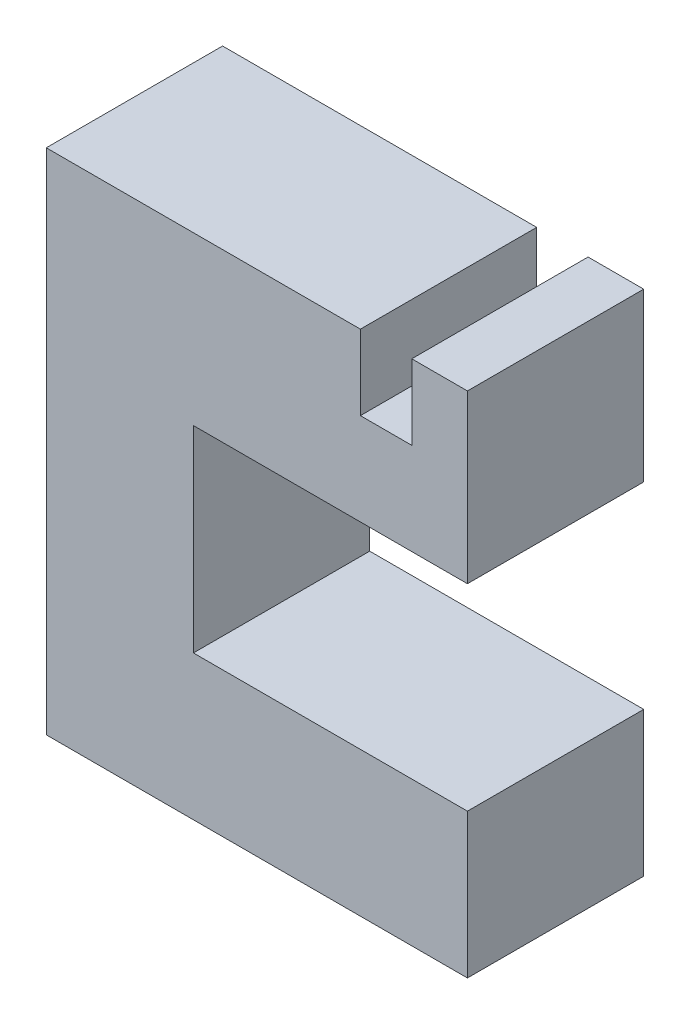
ISO-10303-21;
HEADER;
FILE_DESCRIPTION(('STEP AP214'),'2;1');
FILE_NAME('part.step','',(''),(''),'','','');
FILE_SCHEMA(('AUTOMOTIVE_DESIGN { 1 0 10303 214 1 1 1 1 }'));
ENDSEC;
DATA;
#1=APPLICATION_CONTEXT('core data for automotive mechanical design processes');
#2=APPLICATION_PROTOCOL_DEFINITION('international standard','automotive_design',2000,#1);
#3=PRODUCT_CONTEXT('',#1,'mechanical');
#4=PRODUCT('Part','Part','',(#3));
#5=PRODUCT_RELATED_PRODUCT_CATEGORY('part','',(#4));
#6=PRODUCT_DEFINITION_FORMATION('','',#4);
#7=PRODUCT_DEFINITION_CONTEXT('part definition',#1,'design');
#8=PRODUCT_DEFINITION('design','',#6,#7);
#9=PRODUCT_DEFINITION_SHAPE('','',#8);
#10=(LENGTH_UNIT() NAMED_UNIT(*) SI_UNIT(.MILLI.,.METRE.));
#11=(NAMED_UNIT(*) PLANE_ANGLE_UNIT() SI_UNIT($,.RADIAN.));
#12=(NAMED_UNIT(*) SI_UNIT($,.STERADIAN.) SOLID_ANGLE_UNIT());
#13=UNCERTAINTY_MEASURE_WITH_UNIT(LENGTH_MEASURE(1.E-05),#10,'distance_accuracy_value','');
#14=(GEOMETRIC_REPRESENTATION_CONTEXT(3) GLOBAL_UNCERTAINTY_ASSIGNED_CONTEXT((#13)) GLOBAL_UNIT_ASSIGNED_CONTEXT((#10,
#11,#12)) REPRESENTATION_CONTEXT('',''));
#15=CARTESIAN_POINT('',(0.,0.,0.));
#16=DIRECTION('',(0.,0.,1.));
#17=DIRECTION('',(1.,0.,0.));
#18=AXIS2_PLACEMENT_3D('',#15,#16,#17);
#19=CARTESIAN_POINT('',(0.,0.,20.));
#20=DIRECTION('',(1.,0.,0.));
#21=DIRECTION('',(0.,0.,-1.));
#22=AXIS2_PLACEMENT_3D('',#19,#20,#21);
#23=PLANE('',#22);
#24=DIRECTION('',(0.,-1.,0.));
#25=VECTOR('',#24,1.);
#26=CARTESIAN_POINT('',(0.,0.,0.));
#27=LINE('',#26,#25);
#28=CARTESIAN_POINT('',(0.,57.6785714285714,0.));
#29=VERTEX_POINT('',#28);
#30=CARTESIAN_POINT('',(0.,0.,0.));
#31=VERTEX_POINT('',#30);
#32=EDGE_CURVE('E153',#29,#31,#27,.T.);
#33=ORIENTED_EDGE('',*,*,#32,.T.);
#34=DIRECTION('',(0.,0.,-1.));
#35=VECTOR('',#34,1.);
#36=CARTESIAN_POINT('',(0.,0.,20.));
#37=LINE('',#36,#35);
#38=CARTESIAN_POINT('',(0.,0.,20.));
#39=VERTEX_POINT('',#38);
#40=EDGE_CURVE('E11',#39,#31,#37,.T.);
#41=ORIENTED_EDGE('',*,*,#40,.F.);
#42=DIRECTION('',(0.,-1.,0.));
#43=VECTOR('',#42,1.);
#44=CARTESIAN_POINT('',(0.,0.,20.));
#45=LINE('',#44,#43);
#46=CARTESIAN_POINT('',(0.,57.6785714285714,20.));
#47=VERTEX_POINT('',#46);
#48=EDGE_CURVE('E175',#47,#39,#45,.T.);
#49=ORIENTED_EDGE('',*,*,#48,.F.);
#50=DIRECTION('',(0.,0.,-1.));
#51=VECTOR('',#50,1.);
#52=CARTESIAN_POINT('',(0.,57.6785714285714,20.));
#53=LINE('',#52,#51);
#54=EDGE_CURVE('E149',#47,#29,#53,.T.);
#55=ORIENTED_EDGE('',*,*,#54,.T.);
#56=EDGE_LOOP('',(#33,#41,#49,#55));
#57=FACE_BOUND('',#56,.T.);
#58=ADVANCED_FACE('F33',(#57),#23,.F.);
#59=CARTESIAN_POINT('',(0.,0.,20.));
#60=DIRECTION('',(0.,1.,0.));
#61=DIRECTION('',(0.,0.,1.));
#62=AXIS2_PLACEMENT_3D('',#59,#60,#61);
#63=PLANE('',#62);
#64=DIRECTION('',(1.,0.,0.));
#65=VECTOR('',#64,1.);
#66=CARTESIAN_POINT('',(0.,0.,0.));
#67=LINE('',#66,#65);
#68=CARTESIAN_POINT('',(47.777011133762,0.,0.));
#69=VERTEX_POINT('',#68);
#70=EDGE_CURVE('E156',#31,#69,#67,.T.);
#71=ORIENTED_EDGE('',*,*,#70,.T.);
#72=DIRECTION('',(0.,0.,-1.));
#73=VECTOR('',#72,1.);
#74=CARTESIAN_POINT('',(47.777011133762,0.,20.));
#75=LINE('',#74,#73);
#76=CARTESIAN_POINT('',(47.777011133762,0.,20.));
#77=VERTEX_POINT('',#76);
#78=EDGE_CURVE('E41',#77,#69,#75,.T.);
#79=ORIENTED_EDGE('',*,*,#78,.F.);
#80=DIRECTION('',(1.,0.,0.));
#81=VECTOR('',#80,1.);
#82=CARTESIAN_POINT('',(0.,0.,20.));
#83=LINE('',#82,#81);
#84=EDGE_CURVE('E104',#39,#77,#83,.T.);
#85=ORIENTED_EDGE('',*,*,#84,.F.);
#86=ORIENTED_EDGE('',*,*,#40,.T.);
#87=EDGE_LOOP('',(#71,#79,#85,#86));
#88=FACE_BOUND('',#87,.T.);
#89=ADVANCED_FACE('F253',(#88),#63,.F.);
#90=CARTESIAN_POINT('',(47.777011133762,16.3928571428572,20.));
#91=DIRECTION('',(-1.,0.,0.));
#92=DIRECTION('',(0.,0.,1.));
#93=AXIS2_PLACEMENT_3D('',#90,#91,#92);
#94=PLANE('',#93);
#95=DIRECTION('',(0.,1.,0.));
#96=VECTOR('',#95,1.);
#97=CARTESIAN_POINT('',(47.777011133762,16.3928571428572,0.));
#98=LINE('',#97,#96);
#99=CARTESIAN_POINT('',(47.777011133762,16.3928571428572,0.));
#100=VERTEX_POINT('',#99);
#101=EDGE_CURVE('E158',#69,#100,#98,.T.);
#102=ORIENTED_EDGE('',*,*,#101,.T.);
#103=DIRECTION('',(0.,0.,-1.));
#104=VECTOR('',#103,1.);
#105=CARTESIAN_POINT('',(47.777011133762,16.3928571428572,20.));
#106=LINE('',#105,#104);
#107=CARTESIAN_POINT('',(47.777011133762,16.3928571428572,20.));
#108=VERTEX_POINT('',#107);
#109=EDGE_CURVE('E194',#108,#100,#106,.T.);
#110=ORIENTED_EDGE('',*,*,#109,.F.);
#111=DIRECTION('',(0.,1.,0.));
#112=VECTOR('',#111,1.);
#113=CARTESIAN_POINT('',(47.777011133762,16.3928571428572,20.));
#114=LINE('',#113,#112);
#115=EDGE_CURVE('E202',#77,#108,#114,.T.);
#116=ORIENTED_EDGE('',*,*,#115,.F.);
#117=ORIENTED_EDGE('',*,*,#78,.T.);
#118=EDGE_LOOP('',(#102,#110,#116,#117));
#119=FACE_BOUND('',#118,.T.);
#120=ADVANCED_FACE('F200',(#119),#94,.F.);
#121=CARTESIAN_POINT('',(16.6912968480477,16.3928571428572,20.));
#122=DIRECTION('',(0.,-1.,0.));
#123=DIRECTION('',(0.,0.,-1.));
#124=AXIS2_PLACEMENT_3D('',#121,#122,#123);
#125=PLANE('',#124);
#126=DIRECTION('',(-1.,0.,0.));
#127=VECTOR('',#126,1.);
#128=CARTESIAN_POINT('',(16.6912968480477,16.3928571428572,0.));
#129=LINE('',#128,#127);
#130=CARTESIAN_POINT('',(16.6912968480477,16.3928571428572,0.));
#131=VERTEX_POINT('',#130);
#132=EDGE_CURVE('E160',#100,#131,#129,.T.);
#133=ORIENTED_EDGE('',*,*,#132,.T.);
#134=DIRECTION('',(0.,0.,-1.));
#135=VECTOR('',#134,1.);
#136=CARTESIAN_POINT('',(16.6912968480477,16.3928571428572,20.));
#137=LINE('',#136,#135);
#138=CARTESIAN_POINT('',(16.6912968480477,16.3928571428572,20.));
#139=VERTEX_POINT('',#138);
#140=EDGE_CURVE('E191',#139,#131,#137,.T.);
#141=ORIENTED_EDGE('',*,*,#140,.F.);
#142=DIRECTION('',(-1.,0.,0.));
#143=VECTOR('',#142,1.);
#144=CARTESIAN_POINT('',(16.6912968480477,16.3928571428572,20.));
#145=LINE('',#144,#143);
#146=EDGE_CURVE('E220',#108,#139,#145,.T.);
#147=ORIENTED_EDGE('',*,*,#146,.F.);
#148=ORIENTED_EDGE('',*,*,#109,.T.);
#149=EDGE_LOOP('',(#133,#141,#147,#148));
#150=FACE_BOUND('',#149,.T.);
#151=ADVANCED_FACE('F211',(#150),#125,.F.);
#152=CARTESIAN_POINT('',(16.6912968480477,38.7357142857143,20.));
#153=DIRECTION('',(-1.,0.,0.));
#154=DIRECTION('',(0.,0.,1.));
#155=AXIS2_PLACEMENT_3D('',#152,#153,#154);
#156=PLANE('',#155);
#157=DIRECTION('',(0.,1.,0.));
#158=VECTOR('',#157,1.);
#159=CARTESIAN_POINT('',(16.6912968480477,38.7357142857143,0.));
#160=LINE('',#159,#158);
#161=CARTESIAN_POINT('',(16.6912968480477,38.7357142857143,0.));
#162=VERTEX_POINT('',#161);
#163=EDGE_CURVE('E162',#131,#162,#160,.T.);
#164=ORIENTED_EDGE('',*,*,#163,.T.);
#165=DIRECTION('',(0.,0.,-1.));
#166=VECTOR('',#165,1.);
#167=CARTESIAN_POINT('',(16.6912968480477,38.7357142857143,20.));
#168=LINE('',#167,#166);
#169=CARTESIAN_POINT('',(16.6912968480477,38.7357142857143,20.));
#170=VERTEX_POINT('',#169);
#171=EDGE_CURVE('E188',#170,#162,#168,.T.);
#172=ORIENTED_EDGE('',*,*,#171,.F.);
#173=DIRECTION('',(0.,1.,0.));
#174=VECTOR('',#173,1.);
#175=CARTESIAN_POINT('',(16.6912968480477,38.7357142857143,20.));
#176=LINE('',#175,#174);
#177=EDGE_CURVE('E217',#139,#170,#176,.T.);
#178=ORIENTED_EDGE('',*,*,#177,.F.);
#179=ORIENTED_EDGE('',*,*,#140,.T.);
#180=EDGE_LOOP('',(#164,#172,#178,#179));
#181=FACE_BOUND('',#180,.T.);
#182=ADVANCED_FACE('F215',(#181),#156,.F.);
#183=CARTESIAN_POINT('',(47.777011133762,38.7357142857143,20.));
#184=DIRECTION('',(0.,1.,0.));
#185=DIRECTION('',(0.,0.,1.));
#186=AXIS2_PLACEMENT_3D('',#183,#184,#185);
#187=PLANE('',#186);
#188=DIRECTION('',(1.,0.,0.));
#189=VECTOR('',#188,1.);
#190=CARTESIAN_POINT('',(47.777011133762,38.7357142857143,0.));
#191=LINE('',#190,#189);
#192=CARTESIAN_POINT('',(47.777011133762,38.7357142857143,0.));
#193=VERTEX_POINT('',#192);
#194=EDGE_CURVE('E164',#162,#193,#191,.T.);
#195=ORIENTED_EDGE('',*,*,#194,.T.);
#196=DIRECTION('',(0.,0.,-1.));
#197=VECTOR('',#196,1.);
#198=CARTESIAN_POINT('',(47.777011133762,38.7357142857143,20.));
#199=LINE('',#198,#197);
#200=CARTESIAN_POINT('',(47.777011133762,38.7357142857143,20.));
#201=VERTEX_POINT('',#200);
#202=EDGE_CURVE('E185',#201,#193,#199,.T.);
#203=ORIENTED_EDGE('',*,*,#202,.F.);
#204=DIRECTION('',(1.,0.,0.));
#205=VECTOR('',#204,1.);
#206=CARTESIAN_POINT('',(47.777011133762,38.7357142857143,20.));
#207=LINE('',#206,#205);
#208=EDGE_CURVE('E219',#170,#201,#207,.T.);
#209=ORIENTED_EDGE('',*,*,#208,.F.);
#210=ORIENTED_EDGE('',*,*,#171,.T.);
#211=EDGE_LOOP('',(#195,#203,#209,#210));
#212=FACE_BOUND('',#211,.T.);
#213=ADVANCED_FACE('F266',(#212),#187,.F.);
#214=CARTESIAN_POINT('',(47.777011133762,57.6785714285714,20.));
#215=DIRECTION('',(-1.,0.,0.));
#216=DIRECTION('',(0.,0.,1.));
#217=AXIS2_PLACEMENT_3D('',#214,#215,#216);
#218=PLANE('',#217);
#219=DIRECTION('',(0.,1.,0.));
#220=VECTOR('',#219,1.);
#221=CARTESIAN_POINT('',(47.777011133762,57.6785714285714,0.));
#222=LINE('',#221,#220);
#223=CARTESIAN_POINT('',(47.777011133762,57.6785714285714,0.));
#224=VERTEX_POINT('',#223);
#225=EDGE_CURVE('E166',#193,#224,#222,.T.);
#226=ORIENTED_EDGE('',*,*,#225,.T.);
#227=DIRECTION('',(0.,0.,-1.));
#228=VECTOR('',#227,1.);
#229=CARTESIAN_POINT('',(47.777011133762,57.6785714285714,20.));
#230=LINE('',#229,#228);
#231=CARTESIAN_POINT('',(47.777011133762,57.6785714285714,20.));
#232=VERTEX_POINT('',#231);
#233=EDGE_CURVE('E182',#232,#224,#230,.T.);
#234=ORIENTED_EDGE('',*,*,#233,.F.);
#235=DIRECTION('',(0.,1.,0.));
#236=VECTOR('',#235,1.);
#237=CARTESIAN_POINT('',(47.777011133762,57.6785714285714,20.));
#238=LINE('',#237,#236);
#239=EDGE_CURVE('E222',#201,#232,#238,.T.);
#240=ORIENTED_EDGE('',*,*,#239,.F.);
#241=ORIENTED_EDGE('',*,*,#202,.T.);
#242=EDGE_LOOP('',(#226,#234,#240,#241));
#243=FACE_BOUND('',#242,.T.);
#244=ADVANCED_FACE('F269',(#243),#218,.F.);
#245=CARTESIAN_POINT('',(41.4627254194763,57.6785714285714,20.));
#246=DIRECTION('',(0.,-1.,0.));
#247=DIRECTION('',(0.,0.,-1.));
#248=AXIS2_PLACEMENT_3D('',#245,#246,#247);
#249=PLANE('',#248);
#250=DIRECTION('',(-1.,0.,0.));
#251=VECTOR('',#250,1.);
#252=CARTESIAN_POINT('',(41.4627254194763,57.6785714285714,0.));
#253=LINE('',#252,#251);
#254=CARTESIAN_POINT('',(41.4627254194763,57.6785714285714,0.));
#255=VERTEX_POINT('',#254);
#256=EDGE_CURVE('E168',#224,#255,#253,.T.);
#257=ORIENTED_EDGE('',*,*,#256,.T.);
#258=DIRECTION('',(0.,0.,-1.));
#259=VECTOR('',#258,1.);
#260=CARTESIAN_POINT('',(41.4627254194763,57.6785714285714,20.));
#261=LINE('',#260,#259);
#262=CARTESIAN_POINT('',(41.4627254194763,57.6785714285714,20.));
#263=VERTEX_POINT('',#262);
#264=EDGE_CURVE('E179',#263,#255,#261,.T.);
#265=ORIENTED_EDGE('',*,*,#264,.F.);
#266=DIRECTION('',(-1.,0.,0.));
#267=VECTOR('',#266,1.);
#268=CARTESIAN_POINT('',(41.4627254194763,57.6785714285714,20.));
#269=LINE('',#268,#267);
#270=EDGE_CURVE('E228',#232,#263,#269,.T.);
#271=ORIENTED_EDGE('',*,*,#270,.F.);
#272=ORIENTED_EDGE('',*,*,#233,.T.);
#273=EDGE_LOOP('',(#257,#265,#271,#272));
#274=FACE_BOUND('',#273,.T.);
#275=ADVANCED_FACE('F234',(#274),#249,.F.);
#276=CARTESIAN_POINT('',(41.4627254194763,49.1785714285714,20.));
#277=DIRECTION('',(1.,0.,0.));
#278=DIRECTION('',(0.,0.,-1.));
#279=AXIS2_PLACEMENT_3D('',#276,#277,#278);
#280=PLANE('',#279);
#281=DIRECTION('',(0.,-1.,0.));
#282=VECTOR('',#281,1.);
#283=CARTESIAN_POINT('',(41.4627254194763,49.1785714285714,0.));
#284=LINE('',#283,#282);
#285=CARTESIAN_POINT('',(41.4627254194763,49.1785714285714,0.));
#286=VERTEX_POINT('',#285);
#287=EDGE_CURVE('E170',#255,#286,#284,.T.);
#288=ORIENTED_EDGE('',*,*,#287,.T.);
#289=DIRECTION('',(0.,0.,-1.));
#290=VECTOR('',#289,1.);
#291=CARTESIAN_POINT('',(41.4627254194763,49.1785714285714,20.));
#292=LINE('',#291,#290);
#293=CARTESIAN_POINT('',(41.4627254194763,49.1785714285714,20.));
#294=VERTEX_POINT('',#293);
#295=EDGE_CURVE('E144',#294,#286,#292,.T.);
#296=ORIENTED_EDGE('',*,*,#295,.F.);
#297=DIRECTION('',(0.,-1.,0.));
#298=VECTOR('',#297,1.);
#299=CARTESIAN_POINT('',(41.4627254194763,49.1785714285714,20.));
#300=LINE('',#299,#298);
#301=EDGE_CURVE('E135',#263,#294,#300,.T.);
#302=ORIENTED_EDGE('',*,*,#301,.F.);
#303=ORIENTED_EDGE('',*,*,#264,.T.);
#304=EDGE_LOOP('',(#288,#296,#302,#303));
#305=FACE_BOUND('',#304,.T.);
#306=ADVANCED_FACE('F238',(#305),#280,.F.);
#307=CARTESIAN_POINT('',(35.6341539909048,49.1785714285714,20.));
#308=DIRECTION('',(0.,-1.,0.));
#309=DIRECTION('',(0.,0.,-1.));
#310=AXIS2_PLACEMENT_3D('',#307,#308,#309);
#311=PLANE('',#310);
#312=DIRECTION('',(-1.,0.,0.));
#313=VECTOR('',#312,1.);
#314=CARTESIAN_POINT('',(35.6341539909048,49.1785714285714,0.));
#315=LINE('',#314,#313);
#316=CARTESIAN_POINT('',(35.6341539909048,49.1785714285714,0.));
#317=VERTEX_POINT('',#316);
#318=EDGE_CURVE('E143',#286,#317,#315,.T.);
#319=ORIENTED_EDGE('',*,*,#318,.T.);
#320=DIRECTION('',(0.,0.,-1.));
#321=VECTOR('',#320,1.);
#322=CARTESIAN_POINT('',(35.6341539909048,49.1785714285714,20.));
#323=LINE('',#322,#321);
#324=CARTESIAN_POINT('',(35.6341539909048,49.1785714285714,20.));
#325=VERTEX_POINT('',#324);
#326=EDGE_CURVE('E140',#325,#317,#323,.T.);
#327=ORIENTED_EDGE('',*,*,#326,.F.);
#328=DIRECTION('',(-1.,0.,0.));
#329=VECTOR('',#328,1.);
#330=CARTESIAN_POINT('',(35.6341539909048,49.1785714285714,20.));
#331=LINE('',#330,#329);
#332=EDGE_CURVE('E129',#294,#325,#331,.T.);
#333=ORIENTED_EDGE('',*,*,#332,.F.);
#334=ORIENTED_EDGE('',*,*,#295,.T.);
#335=EDGE_LOOP('',(#319,#327,#333,#334));
#336=FACE_BOUND('',#335,.T.);
#337=ADVANCED_FACE('F141',(#336),#311,.F.);
#338=CARTESIAN_POINT('',(35.6341539909048,57.6785714285714,20.));
#339=DIRECTION('',(-1.,0.,0.));
#340=DIRECTION('',(0.,0.,1.));
#341=AXIS2_PLACEMENT_3D('',#338,#339,#340);
#342=PLANE('',#341);
#343=DIRECTION('',(0.,1.,0.));
#344=VECTOR('',#343,1.);
#345=CARTESIAN_POINT('',(35.6341539909048,57.6785714285714,0.));
#346=LINE('',#345,#344);
#347=CARTESIAN_POINT('',(35.6341539909048,57.6785714285714,0.));
#348=VERTEX_POINT('',#347);
#349=EDGE_CURVE('E90',#317,#348,#346,.T.);
#350=ORIENTED_EDGE('',*,*,#349,.T.);
#351=DIRECTION('',(0.,0.,-1.));
#352=VECTOR('',#351,1.);
#353=CARTESIAN_POINT('',(35.6341539909048,57.6785714285714,20.));
#354=LINE('',#353,#352);
#355=CARTESIAN_POINT('',(35.6341539909048,57.6785714285714,20.));
#356=VERTEX_POINT('',#355);
#357=EDGE_CURVE('E145',#356,#348,#354,.T.);
#358=ORIENTED_EDGE('',*,*,#357,.F.);
#359=DIRECTION('',(0.,1.,0.));
#360=VECTOR('',#359,1.);
#361=CARTESIAN_POINT('',(35.6341539909048,57.6785714285714,20.));
#362=LINE('',#361,#360);
#363=EDGE_CURVE('E133',#325,#356,#362,.T.);
#364=ORIENTED_EDGE('',*,*,#363,.F.);
#365=ORIENTED_EDGE('',*,*,#326,.T.);
#366=EDGE_LOOP('',(#350,#358,#364,#365));
#367=FACE_BOUND('',#366,.T.);
#368=ADVANCED_FACE('F147',(#367),#342,.F.);
#369=CARTESIAN_POINT('',(0.,57.6785714285714,20.));
#370=DIRECTION('',(0.,-1.,0.));
#371=DIRECTION('',(0.,0.,-1.));
#372=AXIS2_PLACEMENT_3D('',#369,#370,#371);
#373=PLANE('',#372);
#374=DIRECTION('',(-1.,0.,0.));
#375=VECTOR('',#374,1.);
#376=CARTESIAN_POINT('',(0.,57.6785714285714,0.));
#377=LINE('',#376,#375);
#378=EDGE_CURVE('E96',#348,#29,#377,.T.);
#379=ORIENTED_EDGE('',*,*,#378,.T.);
#380=ORIENTED_EDGE('',*,*,#54,.F.);
#381=DIRECTION('',(-1.,0.,0.));
#382=VECTOR('',#381,1.);
#383=CARTESIAN_POINT('',(0.,57.6785714285714,20.));
#384=LINE('',#383,#382);
#385=EDGE_CURVE('E49',#356,#47,#384,.T.);
#386=ORIENTED_EDGE('',*,*,#385,.F.);
#387=ORIENTED_EDGE('',*,*,#357,.T.);
#388=EDGE_LOOP('',(#379,#380,#386,#387));
#389=FACE_BOUND('',#388,.T.);
#390=ADVANCED_FACE('F242',(#389),#373,.F.);
#391=CARTESIAN_POINT('',(0.,0.,20.));
#392=DIRECTION('',(0.,0.,-1.));
#393=DIRECTION('',(-1.,0.,0.));
#394=AXIS2_PLACEMENT_3D('',#391,#392,#393);
#395=PLANE('',#394);
#396=ORIENTED_EDGE('',*,*,#48,.T.);
#397=ORIENTED_EDGE('',*,*,#84,.T.);
#398=ORIENTED_EDGE('',*,*,#115,.T.);
#399=ORIENTED_EDGE('',*,*,#146,.T.);
#400=ORIENTED_EDGE('',*,*,#177,.T.);
#401=ORIENTED_EDGE('',*,*,#208,.T.);
#402=ORIENTED_EDGE('',*,*,#239,.T.);
#403=ORIENTED_EDGE('',*,*,#270,.T.);
#404=ORIENTED_EDGE('',*,*,#301,.T.);
#405=ORIENTED_EDGE('',*,*,#332,.T.);
#406=ORIENTED_EDGE('',*,*,#363,.T.);
#407=ORIENTED_EDGE('',*,*,#385,.T.);
#408=EDGE_LOOP('',(#396,#397,#398,#399,#400,#401,#402,#403,#404,#405,#406,#407));
#409=FACE_BOUND('',#408,.T.);
#410=ADVANCED_FACE('F131',(#409),#395,.F.);
#411=CARTESIAN_POINT('',(0.,0.,0.));
#412=DIRECTION('',(0.,0.,-1.));
#413=DIRECTION('',(-1.,0.,0.));
#414=AXIS2_PLACEMENT_3D('',#411,#412,#413);
#415=PLANE('',#414);
#416=ORIENTED_EDGE('',*,*,#32,.F.);
#417=ORIENTED_EDGE('',*,*,#378,.F.);
#418=ORIENTED_EDGE('',*,*,#349,.F.);
#419=ORIENTED_EDGE('',*,*,#318,.F.);
#420=ORIENTED_EDGE('',*,*,#287,.F.);
#421=ORIENTED_EDGE('',*,*,#256,.F.);
#422=ORIENTED_EDGE('',*,*,#225,.F.);
#423=ORIENTED_EDGE('',*,*,#194,.F.);
#424=ORIENTED_EDGE('',*,*,#163,.F.);
#425=ORIENTED_EDGE('',*,*,#132,.F.);
#426=ORIENTED_EDGE('',*,*,#101,.F.);
#427=ORIENTED_EDGE('',*,*,#70,.F.);
#428=EDGE_LOOP('',(#416,#417,#418,#419,#420,#421,#422,#423,#424,#425,#426,#427));
#429=FACE_BOUND('',#428,.T.);
#430=ADVANCED_FACE('F206',(#429),#415,.T.);
#431=CLOSED_SHELL('',(#58,#89,#120,#151,#182,#213,#244,#275,#306,#337,#368,#390,#410,#430));
#432=MANIFOLD_SOLID_BREP('B2',#431);
#433=ADVANCED_BREP_SHAPE_REPRESENTATION('',(#18,#432),#14);
#434=SHAPE_DEFINITION_REPRESENTATION(#9,#433);
ENDSEC;
END-ISO-10303-21;
